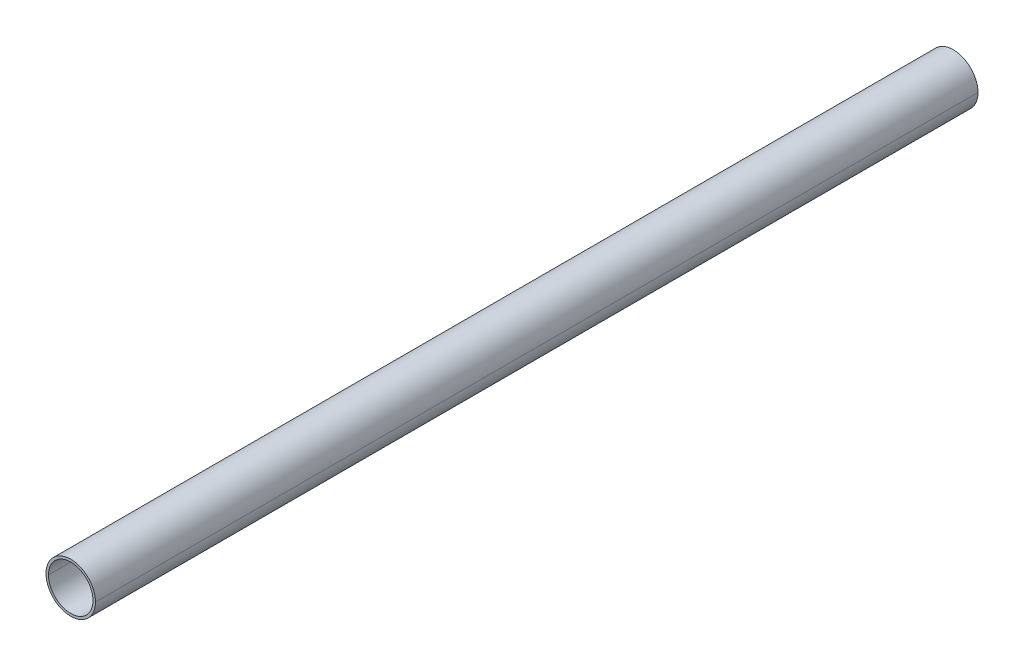
ISO-10303-21;
HEADER;
FILE_DESCRIPTION(('STEP AP214'),'2;1');
FILE_NAME('part.step','',(''),(''),'','','');
FILE_SCHEMA(('AUTOMOTIVE_DESIGN { 1 0 10303 214 1 1 1 1 }'));
ENDSEC;
DATA;
#1=APPLICATION_CONTEXT('core data for automotive mechanical design processes');
#2=APPLICATION_PROTOCOL_DEFINITION('international standard','automotive_design',2000,#1);
#3=PRODUCT_CONTEXT('',#1,'mechanical');
#4=PRODUCT('Part','Part','',(#3));
#5=PRODUCT_RELATED_PRODUCT_CATEGORY('part','',(#4));
#6=PRODUCT_DEFINITION_FORMATION('','',#4);
#7=PRODUCT_DEFINITION_CONTEXT('part definition',#1,'design');
#8=PRODUCT_DEFINITION('design','',#6,#7);
#9=PRODUCT_DEFINITION_SHAPE('','',#8);
#10=(LENGTH_UNIT() NAMED_UNIT(*) SI_UNIT(.MILLI.,.METRE.));
#11=(NAMED_UNIT(*) PLANE_ANGLE_UNIT() SI_UNIT($,.RADIAN.));
#12=(NAMED_UNIT(*) SI_UNIT($,.STERADIAN.) SOLID_ANGLE_UNIT());
#13=UNCERTAINTY_MEASURE_WITH_UNIT(LENGTH_MEASURE(1.E-05),#10,'distance_accuracy_value','');
#14=(GEOMETRIC_REPRESENTATION_CONTEXT(3) GLOBAL_UNCERTAINTY_ASSIGNED_CONTEXT((#13)) GLOBAL_UNIT_ASSIGNED_CONTEXT((#10,
#11,#12)) REPRESENTATION_CONTEXT('',''));
#15=CARTESIAN_POINT('',(0.,0.,0.));
#16=DIRECTION('',(0.,0.,1.));
#17=DIRECTION('',(1.,0.,0.));
#18=AXIS2_PLACEMENT_3D('',#15,#16,#17);
#19=CARTESIAN_POINT('',(0.,0.,355.));
#20=DIRECTION('',(0.,0.,-1.));
#21=DIRECTION('',(-1.,0.,0.));
#22=AXIS2_PLACEMENT_3D('',#19,#20,#21);
#23=CYLINDRICAL_SURFACE('',#22,8.95);
#24=DIRECTION('',(0.,0.,-1.));
#25=VECTOR('',#24,1.);
#26=CARTESIAN_POINT('',(8.95,0.,355.));
#27=LINE('',#26,#25);
#28=CARTESIAN_POINT('',(8.95,0.,355.));
#29=VERTEX_POINT('',#28);
#30=CARTESIAN_POINT('',(8.95,0.,0.));
#31=VERTEX_POINT('',#30);
#32=EDGE_CURVE('E87',#29,#31,#27,.T.);
#33=ORIENTED_EDGE('',*,*,#32,.F.);
#34=CARTESIAN_POINT('',(0.,0.,355.));
#35=DIRECTION('',(0.,0.,1.));
#36=DIRECTION('',(1.,0.,0.));
#37=AXIS2_PLACEMENT_3D('',#34,#35,#36);
#38=CIRCLE('',#37,8.95);
#39=CARTESIAN_POINT('',(-8.95,0.,355.));
#40=VERTEX_POINT('',#39);
#41=EDGE_CURVE('E21',#29,#40,#38,.T.);
#42=ORIENTED_EDGE('',*,*,#41,.T.);
#43=DIRECTION('',(0.,0.,-1.));
#44=VECTOR('',#43,1.);
#45=CARTESIAN_POINT('',(-8.95,0.,355.));
#46=LINE('',#45,#44);
#47=CARTESIAN_POINT('',(-8.95,0.,0.));
#48=VERTEX_POINT('',#47);
#49=EDGE_CURVE('E84',#40,#48,#46,.T.);
#50=ORIENTED_EDGE('',*,*,#49,.T.);
#51=CARTESIAN_POINT('',(0.,0.,0.));
#52=DIRECTION('',(0.,0.,1.));
#53=DIRECTION('',(1.,0.,0.));
#54=AXIS2_PLACEMENT_3D('',#51,#52,#53);
#55=CIRCLE('',#54,8.95);
#56=EDGE_CURVE('E11',#31,#48,#55,.T.);
#57=ORIENTED_EDGE('',*,*,#56,.F.);
#58=EDGE_LOOP('',(#33,#42,#50,#57));
#59=FACE_BOUND('',#58,.T.);
#60=ADVANCED_FACE('F17',(#59),#23,.F.);
#61=CARTESIAN_POINT('',(0.,0.,355.));
#62=DIRECTION('',(0.,0.,-1.));
#63=DIRECTION('',(-1.,0.,0.));
#64=AXIS2_PLACEMENT_3D('',#61,#62,#63);
#65=CYLINDRICAL_SURFACE('',#64,9.95);
#66=DIRECTION('',(0.,0.,-1.));
#67=VECTOR('',#66,1.);
#68=CARTESIAN_POINT('',(9.95,0.,355.));
#69=LINE('',#68,#67);
#70=CARTESIAN_POINT('',(9.95,0.,355.));
#71=VERTEX_POINT('',#70);
#72=CARTESIAN_POINT('',(9.95,0.,0.));
#73=VERTEX_POINT('',#72);
#74=EDGE_CURVE('E225',#71,#73,#69,.T.);
#75=ORIENTED_EDGE('',*,*,#74,.F.);
#76=CARTESIAN_POINT('',(0.,0.,355.));
#77=DIRECTION('',(0.,0.,1.));
#78=DIRECTION('',(1.,0.,0.));
#79=AXIS2_PLACEMENT_3D('',#76,#77,#78);
#80=CIRCLE('',#79,9.95);
#81=CARTESIAN_POINT('',(-9.95,0.,355.));
#82=VERTEX_POINT('',#81);
#83=EDGE_CURVE('E56',#82,#71,#80,.T.);
#84=ORIENTED_EDGE('',*,*,#83,.F.);
#85=DIRECTION('',(0.,0.,-1.));
#86=VECTOR('',#85,1.);
#87=CARTESIAN_POINT('',(-9.95,0.,355.));
#88=LINE('',#87,#86);
#89=CARTESIAN_POINT('',(-9.95,0.,0.));
#90=VERTEX_POINT('',#89);
#91=EDGE_CURVE('E209',#82,#90,#88,.T.);
#92=ORIENTED_EDGE('',*,*,#91,.T.);
#93=CARTESIAN_POINT('',(0.,0.,0.));
#94=DIRECTION('',(0.,0.,1.));
#95=DIRECTION('',(1.,0.,0.));
#96=AXIS2_PLACEMENT_3D('',#93,#94,#95);
#97=CIRCLE('',#96,9.95);
#98=EDGE_CURVE('E28',#90,#73,#97,.T.);
#99=ORIENTED_EDGE('',*,*,#98,.T.);
#100=EDGE_LOOP('',(#75,#84,#92,#99));
#101=FACE_BOUND('',#100,.T.);
#102=ADVANCED_FACE('F112',(#101),#65,.T.);
#103=CARTESIAN_POINT('',(0.,0.,0.));
#104=DIRECTION('',(0.,0.,1.));
#105=DIRECTION('',(1.,0.,0.));
#106=AXIS2_PLACEMENT_3D('',#103,#104,#105);
#107=PLANE('',#106);
#108=CARTESIAN_POINT('',(0.,0.,0.));
#109=DIRECTION('',(0.,0.,1.));
#110=DIRECTION('',(1.,0.,0.));
#111=AXIS2_PLACEMENT_3D('',#108,#109,#110);
#112=CIRCLE('',#111,8.95);
#113=EDGE_CURVE('E95',#48,#31,#112,.T.);
#114=ORIENTED_EDGE('',*,*,#113,.T.);
#115=ORIENTED_EDGE('',*,*,#56,.T.);
#116=EDGE_LOOP('',(#114,#115));
#117=FACE_BOUND('',#116,.T.);
#118=ORIENTED_EDGE('',*,*,#98,.F.);
#119=CARTESIAN_POINT('',(0.,0.,0.));
#120=DIRECTION('',(0.,0.,1.));
#121=DIRECTION('',(1.,0.,0.));
#122=AXIS2_PLACEMENT_3D('',#119,#120,#121);
#123=CIRCLE('',#122,9.95);
#124=EDGE_CURVE('E215',#73,#90,#123,.T.);
#125=ORIENTED_EDGE('',*,*,#124,.F.);
#126=EDGE_LOOP('',(#118,#125));
#127=FACE_BOUND('',#126,.T.);
#128=ADVANCED_FACE('F19',(#117,#127),#107,.F.);
#129=CARTESIAN_POINT('',(0.,0.,355.));
#130=DIRECTION('',(0.,0.,1.));
#131=DIRECTION('',(1.,0.,0.));
#132=AXIS2_PLACEMENT_3D('',#129,#130,#131);
#133=PLANE('',#132);
#134=CARTESIAN_POINT('',(0.,0.,355.));
#135=DIRECTION('',(0.,0.,1.));
#136=DIRECTION('',(1.,0.,0.));
#137=AXIS2_PLACEMENT_3D('',#134,#135,#136);
#138=CIRCLE('',#137,8.95);
#139=EDGE_CURVE('E94',#40,#29,#138,.T.);
#140=ORIENTED_EDGE('',*,*,#139,.F.);
#141=ORIENTED_EDGE('',*,*,#41,.F.);
#142=EDGE_LOOP('',(#140,#141));
#143=FACE_BOUND('',#142,.T.);
#144=ORIENTED_EDGE('',*,*,#83,.T.);
#145=CARTESIAN_POINT('',(0.,0.,355.));
#146=DIRECTION('',(0.,0.,1.));
#147=DIRECTION('',(1.,0.,0.));
#148=AXIS2_PLACEMENT_3D('',#145,#146,#147);
#149=CIRCLE('',#148,9.95);
#150=EDGE_CURVE('E97',#71,#82,#149,.T.);
#151=ORIENTED_EDGE('',*,*,#150,.T.);
#152=EDGE_LOOP('',(#144,#151));
#153=FACE_BOUND('',#152,.T.);
#154=ADVANCED_FACE('F99',(#143,#153),#133,.T.);
#155=CARTESIAN_POINT('',(0.,0.,355.));
#156=DIRECTION('',(0.,0.,-1.));
#157=DIRECTION('',(-1.,0.,0.));
#158=AXIS2_PLACEMENT_3D('',#155,#156,#157);
#159=CYLINDRICAL_SURFACE('',#158,9.95);
#160=ORIENTED_EDGE('',*,*,#150,.F.);
#161=ORIENTED_EDGE('',*,*,#74,.T.);
#162=ORIENTED_EDGE('',*,*,#124,.T.);
#163=ORIENTED_EDGE('',*,*,#91,.F.);
#164=EDGE_LOOP('',(#160,#161,#162,#163));
#165=FACE_BOUND('',#164,.T.);
#166=ADVANCED_FACE('F118',(#165),#159,.T.);
#167=CARTESIAN_POINT('',(0.,0.,355.));
#168=DIRECTION('',(0.,0.,-1.));
#169=DIRECTION('',(-1.,0.,0.));
#170=AXIS2_PLACEMENT_3D('',#167,#168,#169);
#171=CYLINDRICAL_SURFACE('',#170,8.95);
#172=ORIENTED_EDGE('',*,*,#139,.T.);
#173=ORIENTED_EDGE('',*,*,#32,.T.);
#174=ORIENTED_EDGE('',*,*,#113,.F.);
#175=ORIENTED_EDGE('',*,*,#49,.F.);
#176=EDGE_LOOP('',(#172,#173,#174,#175));
#177=FACE_BOUND('',#176,.T.);
#178=ADVANCED_FACE('F93',(#177),#171,.F.);
#179=CLOSED_SHELL('',(#60,#102,#128,#154,#166,#178));
#180=MANIFOLD_SOLID_BREP('B1',#179);
#181=ADVANCED_BREP_SHAPE_REPRESENTATION('',(#18,#180),#14);
#182=SHAPE_DEFINITION_REPRESENTATION(#9,#181);
ENDSEC;
END-ISO-10303-21;
